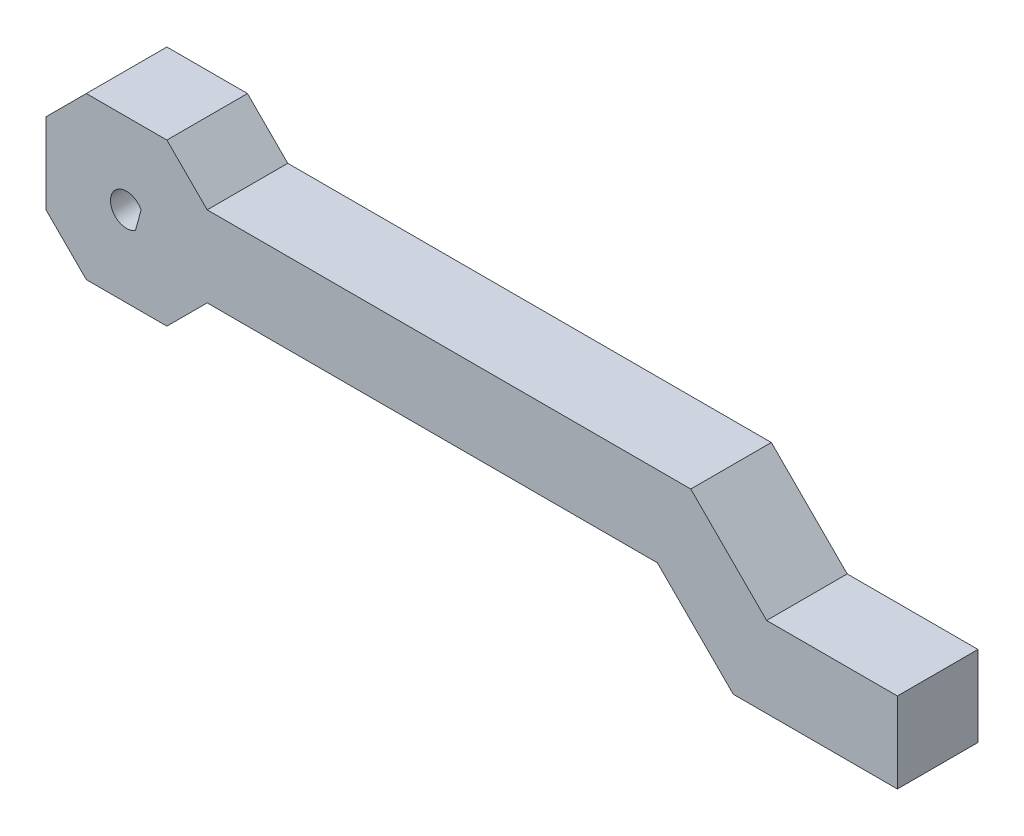
ISO-10303-21;
HEADER;
FILE_DESCRIPTION(('STEP AP214'),'2;1');
FILE_NAME('part.step','',(''),(''),'','','');
FILE_SCHEMA(('AUTOMOTIVE_DESIGN { 1 0 10303 214 1 1 1 1 }'));
ENDSEC;
DATA;
#1=APPLICATION_CONTEXT('core data for automotive mechanical design processes');
#2=APPLICATION_PROTOCOL_DEFINITION('international standard','automotive_design',2000,#1);
#3=PRODUCT_CONTEXT('',#1,'mechanical');
#4=PRODUCT('Part','Part','',(#3));
#5=PRODUCT_RELATED_PRODUCT_CATEGORY('part','',(#4));
#6=PRODUCT_DEFINITION_FORMATION('','',#4);
#7=PRODUCT_DEFINITION_CONTEXT('part definition',#1,'design');
#8=PRODUCT_DEFINITION('design','',#6,#7);
#9=PRODUCT_DEFINITION_SHAPE('','',#8);
#10=(LENGTH_UNIT() NAMED_UNIT(*) SI_UNIT(.MILLI.,.METRE.));
#11=(NAMED_UNIT(*) PLANE_ANGLE_UNIT() SI_UNIT($,.RADIAN.));
#12=(NAMED_UNIT(*) SI_UNIT($,.STERADIAN.) SOLID_ANGLE_UNIT());
#13=UNCERTAINTY_MEASURE_WITH_UNIT(LENGTH_MEASURE(1.E-05),#10,'distance_accuracy_value','');
#14=(GEOMETRIC_REPRESENTATION_CONTEXT(3) GLOBAL_UNCERTAINTY_ASSIGNED_CONTEXT((#13)) GLOBAL_UNIT_ASSIGNED_CONTEXT((#10,
#11,#12)) REPRESENTATION_CONTEXT('',''));
#15=CARTESIAN_POINT('',(0.,0.,0.));
#16=DIRECTION('',(0.,0.,1.));
#17=DIRECTION('',(1.,0.,0.));
#18=AXIS2_PLACEMENT_3D('',#15,#16,#17);
#19=CARTESIAN_POINT('',(0.,0.,20.));
#20=DIRECTION('',(0.,0.,1.));
#21=DIRECTION('',(1.,0.,0.));
#22=AXIS2_PLACEMENT_3D('',#19,#20,#21);
#23=PLANE('',#22);
#24=DIRECTION('',(0.,1.,0.));
#25=VECTOR('',#24,1.);
#26=CARTESIAN_POINT('',(85.3598963760236,1.17277647972449,20.));
#27=LINE('',#26,#25);
#28=CARTESIAN_POINT('',(85.3598963760236,1.17277647972449,20.));
#29=VERTEX_POINT('',#28);
#30=CARTESIAN_POINT('',(85.3598963760236,21.1727764797245,20.));
#31=VERTEX_POINT('',#30);
#32=EDGE_CURVE('E175',#29,#31,#27,.T.);
#33=ORIENTED_EDGE('',*,*,#32,.T.);
#34=DIRECTION('',(-1.,0.,0.));
#35=VECTOR('',#34,1.);
#36=CARTESIAN_POINT('',(85.3598963760236,21.1727764797245,20.));
#37=LINE('',#36,#35);
#38=CARTESIAN_POINT('',(52.9046994578378,21.1727764797241,20.));
#39=VERTEX_POINT('',#38);
#40=EDGE_CURVE('E179',#31,#39,#37,.T.);
#41=ORIENTED_EDGE('',*,*,#40,.T.);
#42=DIRECTION('',(-0.707106781186549,0.707106781186546,0.));
#43=VECTOR('',#42,1.);
#44=CARTESIAN_POINT('',(52.9046994578378,21.1727764797241,20.));
#45=LINE('',#44,#43);
#46=CARTESIAN_POINT('',(34.0744722902996,40.0030036472623,20.));
#47=VERTEX_POINT('',#46);
#48=EDGE_CURVE('E183',#39,#47,#45,.T.);
#49=ORIENTED_EDGE('',*,*,#48,.T.);
#50=DIRECTION('',(-1.,0.,0.));
#51=VECTOR('',#50,1.);
#52=CARTESIAN_POINT('',(-85.9255277097004,40.0030036472623,20.));
#53=LINE('',#52,#51);
#54=CARTESIAN_POINT('',(-85.9255277097004,40.0030036472623,20.));
#55=VERTEX_POINT('',#54);
#56=EDGE_CURVE('E186',#47,#55,#53,.T.);
#57=ORIENTED_EDGE('',*,*,#56,.T.);
#58=DIRECTION('',(-0.707106735333313,0.707106827039779,0.));
#59=VECTOR('',#58,1.);
#60=CARTESIAN_POINT('',(-95.9255277097004,50.0030049441876,20.));
#61=LINE('',#60,#59);
#62=CARTESIAN_POINT('',(-95.9255277097004,50.0030049441876,20.));
#63=VERTEX_POINT('',#62);
#64=EDGE_CURVE('E189',#55,#63,#61,.T.);
#65=ORIENTED_EDGE('',*,*,#64,.T.);
#66=DIRECTION('',(-1.,0.,0.));
#67=VECTOR('',#66,1.);
#68=CARTESIAN_POINT('',(-115.9255277097,50.0030049441876,20.));
#69=LINE('',#68,#67);
#70=CARTESIAN_POINT('',(-115.9255277097,50.0030049441876,20.));
#71=VERTEX_POINT('',#70);
#72=EDGE_CURVE('E192',#63,#71,#69,.T.);
#73=ORIENTED_EDGE('',*,*,#72,.T.);
#74=DIRECTION('',(-0.707106781186549,-0.707106781186546,0.));
#75=VECTOR('',#74,1.);
#76=CARTESIAN_POINT('',(-125.9255277097,40.0030049441876,20.));
#77=LINE('',#76,#75);
#78=CARTESIAN_POINT('',(-125.9255277097,40.0030049441876,20.));
#79=VERTEX_POINT('',#78);
#80=EDGE_CURVE('E195',#71,#79,#77,.T.);
#81=ORIENTED_EDGE('',*,*,#80,.T.);
#82=DIRECTION('',(0.,-1.,0.));
#83=VECTOR('',#82,1.);
#84=CARTESIAN_POINT('',(-125.9255277097,40.0030049441876,20.));
#85=LINE('',#84,#83);
#86=CARTESIAN_POINT('',(-125.9255277097,20.0030049441876,20.));
#87=VERTEX_POINT('',#86);
#88=EDGE_CURVE('E198',#79,#87,#85,.T.);
#89=ORIENTED_EDGE('',*,*,#88,.T.);
#90=DIRECTION('',(0.707106781186549,-0.707106781186546,0.));
#91=VECTOR('',#90,1.);
#92=CARTESIAN_POINT('',(-125.9255277097,20.0030049441876,20.));
#93=LINE('',#92,#91);
#94=CARTESIAN_POINT('',(-115.9255277097,10.0030049441876,20.));
#95=VERTEX_POINT('',#94);
#96=EDGE_CURVE('E201',#87,#95,#93,.T.);
#97=ORIENTED_EDGE('',*,*,#96,.T.);
#98=DIRECTION('',(1.,0.,0.));
#99=VECTOR('',#98,1.);
#100=CARTESIAN_POINT('',(-115.9255277097,10.0030049441876,20.));
#101=LINE('',#100,#99);
#102=CARTESIAN_POINT('',(-95.9255277097004,10.0030049441876,20.));
#103=VERTEX_POINT('',#102);
#104=EDGE_CURVE('E204',#95,#103,#101,.T.);
#105=ORIENTED_EDGE('',*,*,#104,.T.);
#106=DIRECTION('',(0.707106827039785,0.707106735333307,0.));
#107=VECTOR('',#106,1.);
#108=CARTESIAN_POINT('',(-95.9255277097004,10.0030049441876,20.));
#109=LINE('',#108,#107);
#110=CARTESIAN_POINT('',(-85.9255277097004,20.0030036472623,20.));
#111=VERTEX_POINT('',#110);
#112=EDGE_CURVE('E207',#103,#111,#109,.T.);
#113=ORIENTED_EDGE('',*,*,#112,.T.);
#114=DIRECTION('',(1.,0.,0.));
#115=VECTOR('',#114,1.);
#116=CARTESIAN_POINT('',(-85.9255277097004,20.0030036472623,20.));
#117=LINE('',#116,#115);
#118=CARTESIAN_POINT('',(25.7902010428377,20.0030036472623,20.));
#119=VERTEX_POINT('',#118);
#120=EDGE_CURVE('E210',#111,#119,#117,.T.);
#121=ORIENTED_EDGE('',*,*,#120,.T.);
#122=DIRECTION('',(0.707106781186549,-0.707106781186546,0.));
#123=VECTOR('',#122,1.);
#124=CARTESIAN_POINT('',(25.7902010428377,20.0030036472623,20.));
#125=LINE('',#124,#123);
#126=CARTESIAN_POINT('',(44.6204282103759,1.17277647972414,20.));
#127=VERTEX_POINT('',#126);
#128=EDGE_CURVE('E213',#119,#127,#125,.T.);
#129=ORIENTED_EDGE('',*,*,#128,.T.);
#130=DIRECTION('',(1.,0.,0.));
#131=VECTOR('',#130,1.);
#132=CARTESIAN_POINT('',(44.6204282103759,1.17277647972414,20.));
#133=LINE('',#132,#131);
#134=EDGE_CURVE('E216',#127,#29,#133,.T.);
#135=ORIENTED_EDGE('',*,*,#134,.T.);
#136=EDGE_LOOP('',(#33,#41,#49,#57,#65,#73,#81,#89,#97,#105,#113,#121,#129,#135));
#137=FACE_BOUND('',#136,.T.);
#138=DIRECTION('',(0.260619308833868,0.965441648088043,0.));
#139=VECTOR('',#138,1.);
#140=CARTESIAN_POINT('',(-103.718736643472,26.6668285115007,20.));
#141=LINE('',#140,#139);
#142=CARTESIAN_POINT('',(-103.718736643472,26.6668285115007,20.));
#143=VERTEX_POINT('',#142);
#144=CARTESIAN_POINT('',(-102.3396688874,31.7754655238714,20.));
#145=VERTEX_POINT('',#144);
#146=EDGE_CURVE('E152',#143,#145,#141,.T.);
#147=ORIENTED_EDGE('',*,*,#146,.F.);
#148=CARTESIAN_POINT('',(-105.9255277097,30.0030049441876,20.));
#149=DIRECTION('',(0.,0.,1.));
#150=DIRECTION('',(1.,0.,0.));
#151=AXIS2_PLACEMENT_3D('',#148,#149,#150);
#152=CIRCLE('',#151,4.00000000000001);
#153=EDGE_CURVE('E159',#145,#143,#152,.T.);
#154=ORIENTED_EDGE('',*,*,#153,.F.);
#155=EDGE_LOOP('',(#147,#154));
#156=FACE_BOUND('',#155,.T.);
#157=ADVANCED_FACE('F39',(#137,#156),#23,.T.);
#158=CARTESIAN_POINT('',(0.,0.,0.));
#159=DIRECTION('',(0.,0.,1.));
#160=DIRECTION('',(1.,0.,0.));
#161=AXIS2_PLACEMENT_3D('',#158,#159,#160);
#162=PLANE('',#161);
#163=DIRECTION('',(0.,1.,0.));
#164=VECTOR('',#163,1.);
#165=CARTESIAN_POINT('',(85.3598963760236,1.17277647972449,0.));
#166=LINE('',#165,#164);
#167=CARTESIAN_POINT('',(85.3598963760236,1.17277647972449,0.));
#168=VERTEX_POINT('',#167);
#169=CARTESIAN_POINT('',(85.3598963760236,21.1727764797245,0.));
#170=VERTEX_POINT('',#169);
#171=EDGE_CURVE('E174',#168,#170,#166,.T.);
#172=ORIENTED_EDGE('',*,*,#171,.F.);
#173=DIRECTION('',(1.,0.,0.));
#174=VECTOR('',#173,1.);
#175=CARTESIAN_POINT('',(44.6204282103759,1.17277647972414,0.));
#176=LINE('',#175,#174);
#177=CARTESIAN_POINT('',(44.6204282103759,1.17277647972414,0.));
#178=VERTEX_POINT('',#177);
#179=EDGE_CURVE('E180',#178,#168,#176,.T.);
#180=ORIENTED_EDGE('',*,*,#179,.F.);
#181=DIRECTION('',(0.707106781186549,-0.707106781186546,0.));
#182=VECTOR('',#181,1.);
#183=CARTESIAN_POINT('',(25.7902010428377,20.0030036472623,0.));
#184=LINE('',#183,#182);
#185=CARTESIAN_POINT('',(25.7902010428377,20.0030036472623,0.));
#186=VERTEX_POINT('',#185);
#187=EDGE_CURVE('E256',#186,#178,#184,.T.);
#188=ORIENTED_EDGE('',*,*,#187,.F.);
#189=DIRECTION('',(1.,0.,0.));
#190=VECTOR('',#189,1.);
#191=CARTESIAN_POINT('',(-85.9255277097004,20.0030036472623,0.));
#192=LINE('',#191,#190);
#193=CARTESIAN_POINT('',(-85.9255277097004,20.0030036472623,0.));
#194=VERTEX_POINT('',#193);
#195=EDGE_CURVE('E253',#194,#186,#192,.T.);
#196=ORIENTED_EDGE('',*,*,#195,.F.);
#197=DIRECTION('',(0.707106827039785,0.707106735333307,0.));
#198=VECTOR('',#197,1.);
#199=CARTESIAN_POINT('',(-95.9255277097004,10.0030049441876,0.));
#200=LINE('',#199,#198);
#201=CARTESIAN_POINT('',(-95.9255277097004,10.0030049441876,0.));
#202=VERTEX_POINT('',#201);
#203=EDGE_CURVE('E250',#202,#194,#200,.T.);
#204=ORIENTED_EDGE('',*,*,#203,.F.);
#205=DIRECTION('',(1.,0.,0.));
#206=VECTOR('',#205,1.);
#207=CARTESIAN_POINT('',(-115.9255277097,10.0030049441876,0.));
#208=LINE('',#207,#206);
#209=CARTESIAN_POINT('',(-115.9255277097,10.0030049441876,0.));
#210=VERTEX_POINT('',#209);
#211=EDGE_CURVE('E247',#210,#202,#208,.T.);
#212=ORIENTED_EDGE('',*,*,#211,.F.);
#213=DIRECTION('',(0.707106781186549,-0.707106781186546,0.));
#214=VECTOR('',#213,1.);
#215=CARTESIAN_POINT('',(-125.9255277097,20.0030049441876,0.));
#216=LINE('',#215,#214);
#217=CARTESIAN_POINT('',(-125.9255277097,20.0030049441876,0.));
#218=VERTEX_POINT('',#217);
#219=EDGE_CURVE('E244',#218,#210,#216,.T.);
#220=ORIENTED_EDGE('',*,*,#219,.F.);
#221=DIRECTION('',(0.,-1.,0.));
#222=VECTOR('',#221,1.);
#223=CARTESIAN_POINT('',(-125.9255277097,40.0030049441876,0.));
#224=LINE('',#223,#222);
#225=CARTESIAN_POINT('',(-125.9255277097,40.0030049441876,0.));
#226=VERTEX_POINT('',#225);
#227=EDGE_CURVE('E241',#226,#218,#224,.T.);
#228=ORIENTED_EDGE('',*,*,#227,.F.);
#229=DIRECTION('',(-0.707106781186549,-0.707106781186546,0.));
#230=VECTOR('',#229,1.);
#231=CARTESIAN_POINT('',(-125.9255277097,40.0030049441876,0.));
#232=LINE('',#231,#230);
#233=CARTESIAN_POINT('',(-115.9255277097,50.0030049441876,0.));
#234=VERTEX_POINT('',#233);
#235=EDGE_CURVE('E238',#234,#226,#232,.T.);
#236=ORIENTED_EDGE('',*,*,#235,.F.);
#237=DIRECTION('',(-1.,0.,0.));
#238=VECTOR('',#237,1.);
#239=CARTESIAN_POINT('',(-115.9255277097,50.0030049441876,0.));
#240=LINE('',#239,#238);
#241=CARTESIAN_POINT('',(-95.9255277097004,50.0030049441876,0.));
#242=VERTEX_POINT('',#241);
#243=EDGE_CURVE('E235',#242,#234,#240,.T.);
#244=ORIENTED_EDGE('',*,*,#243,.F.);
#245=DIRECTION('',(-0.707106735333313,0.707106827039779,0.));
#246=VECTOR('',#245,1.);
#247=CARTESIAN_POINT('',(-95.9255277097004,50.0030049441876,0.));
#248=LINE('',#247,#246);
#249=CARTESIAN_POINT('',(-85.9255277097004,40.0030036472623,0.));
#250=VERTEX_POINT('',#249);
#251=EDGE_CURVE('E232',#250,#242,#248,.T.);
#252=ORIENTED_EDGE('',*,*,#251,.F.);
#253=DIRECTION('',(-1.,0.,0.));
#254=VECTOR('',#253,1.);
#255=CARTESIAN_POINT('',(-85.9255277097004,40.0030036472623,0.));
#256=LINE('',#255,#254);
#257=CARTESIAN_POINT('',(34.0744722902996,40.0030036472623,0.));
#258=VERTEX_POINT('',#257);
#259=EDGE_CURVE('E229',#258,#250,#256,.T.);
#260=ORIENTED_EDGE('',*,*,#259,.F.);
#261=DIRECTION('',(-0.707106781186549,0.707106781186546,0.));
#262=VECTOR('',#261,1.);
#263=CARTESIAN_POINT('',(52.9046994578378,21.1727764797241,0.));
#264=LINE('',#263,#262);
#265=CARTESIAN_POINT('',(52.9046994578378,21.1727764797241,0.));
#266=VERTEX_POINT('',#265);
#267=EDGE_CURVE('E226',#266,#258,#264,.T.);
#268=ORIENTED_EDGE('',*,*,#267,.F.);
#269=DIRECTION('',(-1.,0.,0.));
#270=VECTOR('',#269,1.);
#271=CARTESIAN_POINT('',(85.3598963760236,21.1727764797245,0.));
#272=LINE('',#271,#270);
#273=EDGE_CURVE('E223',#170,#266,#272,.T.);
#274=ORIENTED_EDGE('',*,*,#273,.F.);
#275=EDGE_LOOP('',(#172,#180,#188,#196,#204,#212,#220,#228,#236,#244,#252,#260,#268,#274));
#276=FACE_BOUND('',#275,.T.);
#277=CARTESIAN_POINT('',(-105.9255277097,30.0030049441876,0.));
#278=DIRECTION('',(0.,0.,1.));
#279=DIRECTION('',(1.,0.,0.));
#280=AXIS2_PLACEMENT_3D('',#277,#278,#279);
#281=CIRCLE('',#280,4.00000000000001);
#282=CARTESIAN_POINT('',(-102.3396688874,31.7754655238714,0.));
#283=VERTEX_POINT('',#282);
#284=CARTESIAN_POINT('',(-103.718736643472,26.6668285115007,0.));
#285=VERTEX_POINT('',#284);
#286=EDGE_CURVE('E62',#283,#285,#281,.T.);
#287=ORIENTED_EDGE('',*,*,#286,.T.);
#288=DIRECTION('',(0.260619308833868,0.965441648088043,0.));
#289=VECTOR('',#288,1.);
#290=CARTESIAN_POINT('',(-103.718736643472,26.6668285115007,0.));
#291=LINE('',#290,#289);
#292=EDGE_CURVE('E165',#285,#283,#291,.T.);
#293=ORIENTED_EDGE('',*,*,#292,.T.);
#294=EDGE_LOOP('',(#287,#293));
#295=FACE_BOUND('',#294,.T.);
#296=ADVANCED_FACE('F319',(#276,#295),#162,.F.);
#297=CARTESIAN_POINT('',(85.3598963760236,1.17277647972449,20.));
#298=DIRECTION('',(-1.,0.,0.));
#299=DIRECTION('',(0.,0.,1.));
#300=AXIS2_PLACEMENT_3D('',#297,#298,#299);
#301=PLANE('',#300);
#302=ORIENTED_EDGE('',*,*,#171,.T.);
#303=DIRECTION('',(0.,0.,-1.));
#304=VECTOR('',#303,1.);
#305=CARTESIAN_POINT('',(85.3598963760236,21.1727764797245,20.));
#306=LINE('',#305,#304);
#307=EDGE_CURVE('E11',#31,#170,#306,.T.);
#308=ORIENTED_EDGE('',*,*,#307,.F.);
#309=ORIENTED_EDGE('',*,*,#32,.F.);
#310=DIRECTION('',(0.,0.,-1.));
#311=VECTOR('',#310,1.);
#312=CARTESIAN_POINT('',(85.3598963760236,1.17277647972449,20.));
#313=LINE('',#312,#311);
#314=EDGE_CURVE('E219',#29,#168,#313,.T.);
#315=ORIENTED_EDGE('',*,*,#314,.T.);
#316=EDGE_LOOP('',(#302,#308,#309,#315));
#317=FACE_BOUND('',#316,.T.);
#318=ADVANCED_FACE('F41',(#317),#301,.F.);
#319=CARTESIAN_POINT('',(85.3598963760236,21.1727764797245,20.));
#320=DIRECTION('',(0.,-1.,0.));
#321=DIRECTION('',(1.,0.,0.));
#322=AXIS2_PLACEMENT_3D('',#319,#320,#321);
#323=PLANE('',#322);
#324=ORIENTED_EDGE('',*,*,#273,.T.);
#325=DIRECTION('',(0.,0.,-1.));
#326=VECTOR('',#325,1.);
#327=CARTESIAN_POINT('',(52.9046994578378,21.1727764797241,20.));
#328=LINE('',#327,#326);
#329=EDGE_CURVE('E48',#39,#266,#328,.T.);
#330=ORIENTED_EDGE('',*,*,#329,.F.);
#331=ORIENTED_EDGE('',*,*,#40,.F.);
#332=ORIENTED_EDGE('',*,*,#307,.T.);
#333=EDGE_LOOP('',(#324,#330,#331,#332));
#334=FACE_BOUND('',#333,.T.);
#335=ADVANCED_FACE('F336',(#334),#323,.F.);
#336=CARTESIAN_POINT('',(52.9046994578378,21.1727764797241,20.));
#337=DIRECTION('',(-0.707106781186546,-0.707106781186549,0.));
#338=DIRECTION('',(0.707106781186549,-0.707106781186546,0.));
#339=AXIS2_PLACEMENT_3D('',#336,#337,#338);
#340=PLANE('',#339);
#341=ORIENTED_EDGE('',*,*,#267,.T.);
#342=DIRECTION('',(0.,0.,-1.));
#343=VECTOR('',#342,1.);
#344=CARTESIAN_POINT('',(34.0744722902996,40.0030036472623,20.));
#345=LINE('',#344,#343);
#346=EDGE_CURVE('E304',#47,#258,#345,.T.);
#347=ORIENTED_EDGE('',*,*,#346,.F.);
#348=ORIENTED_EDGE('',*,*,#48,.F.);
#349=ORIENTED_EDGE('',*,*,#329,.T.);
#350=EDGE_LOOP('',(#341,#347,#348,#349));
#351=FACE_BOUND('',#350,.T.);
#352=ADVANCED_FACE('F313',(#351),#340,.F.);
#353=CARTESIAN_POINT('',(-85.9255277097004,40.0030036472623,20.));
#354=DIRECTION('',(0.,-1.,0.));
#355=DIRECTION('',(0.,0.,-1.));
#356=AXIS2_PLACEMENT_3D('',#353,#354,#355);
#357=PLANE('',#356);
#358=ORIENTED_EDGE('',*,*,#259,.T.);
#359=DIRECTION('',(0.,0.,-1.));
#360=VECTOR('',#359,1.);
#361=CARTESIAN_POINT('',(-85.9255277097004,40.0030036472623,20.));
#362=LINE('',#361,#360);
#363=EDGE_CURVE('E300',#55,#250,#362,.T.);
#364=ORIENTED_EDGE('',*,*,#363,.F.);
#365=ORIENTED_EDGE('',*,*,#56,.F.);
#366=ORIENTED_EDGE('',*,*,#346,.T.);
#367=EDGE_LOOP('',(#358,#364,#365,#366));
#368=FACE_BOUND('',#367,.T.);
#369=ADVANCED_FACE('F325',(#368),#357,.F.);
#370=CARTESIAN_POINT('',(-95.9255277097004,50.0030049441876,20.));
#371=DIRECTION('',(-0.707106827039779,-0.707106735333313,0.));
#372=DIRECTION('',(0.707106735333313,-0.707106827039779,0.));
#373=AXIS2_PLACEMENT_3D('',#370,#371,#372);
#374=PLANE('',#373);
#375=ORIENTED_EDGE('',*,*,#251,.T.);
#376=DIRECTION('',(0.,0.,-1.));
#377=VECTOR('',#376,1.);
#378=CARTESIAN_POINT('',(-95.9255277097004,50.0030049441876,20.));
#379=LINE('',#378,#377);
#380=EDGE_CURVE('E296',#63,#242,#379,.T.);
#381=ORIENTED_EDGE('',*,*,#380,.F.);
#382=ORIENTED_EDGE('',*,*,#64,.F.);
#383=ORIENTED_EDGE('',*,*,#363,.T.);
#384=EDGE_LOOP('',(#375,#381,#382,#383));
#385=FACE_BOUND('',#384,.T.);
#386=ADVANCED_FACE('F329',(#385),#374,.F.);
#387=CARTESIAN_POINT('',(-115.9255277097,50.0030049441876,20.));
#388=DIRECTION('',(0.,-1.,0.));
#389=DIRECTION('',(0.,0.,-1.));
#390=AXIS2_PLACEMENT_3D('',#387,#388,#389);
#391=PLANE('',#390);
#392=ORIENTED_EDGE('',*,*,#243,.T.);
#393=DIRECTION('',(0.,0.,-1.));
#394=VECTOR('',#393,1.);
#395=CARTESIAN_POINT('',(-115.9255277097,50.0030049441876,20.));
#396=LINE('',#395,#394);
#397=EDGE_CURVE('E292',#71,#234,#396,.T.);
#398=ORIENTED_EDGE('',*,*,#397,.F.);
#399=ORIENTED_EDGE('',*,*,#72,.F.);
#400=ORIENTED_EDGE('',*,*,#380,.T.);
#401=EDGE_LOOP('',(#392,#398,#399,#400));
#402=FACE_BOUND('',#401,.T.);
#403=ADVANCED_FACE('F379',(#402),#391,.F.);
#404=CARTESIAN_POINT('',(-125.9255277097,40.0030049441876,20.));
#405=DIRECTION('',(0.707106781186546,-0.707106781186549,0.));
#406=DIRECTION('',(0.707106781186549,0.707106781186546,0.));
#407=AXIS2_PLACEMENT_3D('',#404,#405,#406);
#408=PLANE('',#407);
#409=ORIENTED_EDGE('',*,*,#235,.T.);
#410=DIRECTION('',(0.,0.,-1.));
#411=VECTOR('',#410,1.);
#412=CARTESIAN_POINT('',(-125.9255277097,40.0030049441876,20.));
#413=LINE('',#412,#411);
#414=EDGE_CURVE('E288',#79,#226,#413,.T.);
#415=ORIENTED_EDGE('',*,*,#414,.F.);
#416=ORIENTED_EDGE('',*,*,#80,.F.);
#417=ORIENTED_EDGE('',*,*,#397,.T.);
#418=EDGE_LOOP('',(#409,#415,#416,#417));
#419=FACE_BOUND('',#418,.T.);
#420=ADVANCED_FACE('F377',(#419),#408,.F.);
#421=CARTESIAN_POINT('',(-125.9255277097,40.0030049441876,20.));
#422=DIRECTION('',(1.,0.,0.));
#423=DIRECTION('',(0.,0.,-1.));
#424=AXIS2_PLACEMENT_3D('',#421,#422,#423);
#425=PLANE('',#424);
#426=ORIENTED_EDGE('',*,*,#227,.T.);
#427=DIRECTION('',(0.,0.,-1.));
#428=VECTOR('',#427,1.);
#429=CARTESIAN_POINT('',(-125.9255277097,20.0030049441876,20.));
#430=LINE('',#429,#428);
#431=EDGE_CURVE('E284',#87,#218,#430,.T.);
#432=ORIENTED_EDGE('',*,*,#431,.F.);
#433=ORIENTED_EDGE('',*,*,#88,.F.);
#434=ORIENTED_EDGE('',*,*,#414,.T.);
#435=EDGE_LOOP('',(#426,#432,#433,#434));
#436=FACE_BOUND('',#435,.T.);
#437=ADVANCED_FACE('F372',(#436),#425,.F.);
#438=CARTESIAN_POINT('',(-125.9255277097,20.0030049441876,20.));
#439=DIRECTION('',(0.707106781186546,0.707106781186549,0.));
#440=DIRECTION('',(-0.707106781186549,0.707106781186546,0.));
#441=AXIS2_PLACEMENT_3D('',#438,#439,#440);
#442=PLANE('',#441);
#443=ORIENTED_EDGE('',*,*,#219,.T.);
#444=DIRECTION('',(0.,0.,-1.));
#445=VECTOR('',#444,1.);
#446=CARTESIAN_POINT('',(-115.9255277097,10.0030049441876,20.));
#447=LINE('',#446,#445);
#448=EDGE_CURVE('E280',#95,#210,#447,.T.);
#449=ORIENTED_EDGE('',*,*,#448,.F.);
#450=ORIENTED_EDGE('',*,*,#96,.F.);
#451=ORIENTED_EDGE('',*,*,#431,.T.);
#452=EDGE_LOOP('',(#443,#449,#450,#451));
#453=FACE_BOUND('',#452,.T.);
#454=ADVANCED_FACE('F367',(#453),#442,.F.);
#455=CARTESIAN_POINT('',(-115.9255277097,10.0030049441876,20.));
#456=DIRECTION('',(0.,1.,0.));
#457=DIRECTION('',(0.,0.,1.));
#458=AXIS2_PLACEMENT_3D('',#455,#456,#457);
#459=PLANE('',#458);
#460=ORIENTED_EDGE('',*,*,#211,.T.);
#461=DIRECTION('',(0.,0.,-1.));
#462=VECTOR('',#461,1.);
#463=CARTESIAN_POINT('',(-95.9255277097004,10.0030049441876,20.));
#464=LINE('',#463,#462);
#465=EDGE_CURVE('E276',#103,#202,#464,.T.);
#466=ORIENTED_EDGE('',*,*,#465,.F.);
#467=ORIENTED_EDGE('',*,*,#104,.F.);
#468=ORIENTED_EDGE('',*,*,#448,.T.);
#469=EDGE_LOOP('',(#460,#466,#467,#468));
#470=FACE_BOUND('',#469,.T.);
#471=ADVANCED_FACE('F363',(#470),#459,.F.);
#472=CARTESIAN_POINT('',(-95.9255277097004,10.0030049441876,20.));
#473=DIRECTION('',(-0.707106735333307,0.707106827039785,0.));
#474=DIRECTION('',(-0.707106827039785,-0.707106735333307,0.));
#475=AXIS2_PLACEMENT_3D('',#472,#473,#474);
#476=PLANE('',#475);
#477=ORIENTED_EDGE('',*,*,#203,.T.);
#478=DIRECTION('',(0.,0.,-1.));
#479=VECTOR('',#478,1.);
#480=CARTESIAN_POINT('',(-85.9255277097004,20.0030036472623,20.));
#481=LINE('',#480,#479);
#482=EDGE_CURVE('E272',#111,#194,#481,.T.);
#483=ORIENTED_EDGE('',*,*,#482,.F.);
#484=ORIENTED_EDGE('',*,*,#112,.F.);
#485=ORIENTED_EDGE('',*,*,#465,.T.);
#486=EDGE_LOOP('',(#477,#483,#484,#485));
#487=FACE_BOUND('',#486,.T.);
#488=ADVANCED_FACE('F358',(#487),#476,.F.);
#489=CARTESIAN_POINT('',(-85.9255277097004,20.0030036472623,20.));
#490=DIRECTION('',(0.,1.,0.));
#491=DIRECTION('',(0.,0.,1.));
#492=AXIS2_PLACEMENT_3D('',#489,#490,#491);
#493=PLANE('',#492);
#494=ORIENTED_EDGE('',*,*,#195,.T.);
#495=DIRECTION('',(0.,0.,-1.));
#496=VECTOR('',#495,1.);
#497=CARTESIAN_POINT('',(25.7902010428377,20.0030036472623,20.));
#498=LINE('',#497,#496);
#499=EDGE_CURVE('E268',#119,#186,#498,.T.);
#500=ORIENTED_EDGE('',*,*,#499,.F.);
#501=ORIENTED_EDGE('',*,*,#120,.F.);
#502=ORIENTED_EDGE('',*,*,#482,.T.);
#503=EDGE_LOOP('',(#494,#500,#501,#502));
#504=FACE_BOUND('',#503,.T.);
#505=ADVANCED_FACE('F352',(#504),#493,.F.);
#506=CARTESIAN_POINT('',(25.7902010428377,20.0030036472623,20.));
#507=DIRECTION('',(0.707106781186546,0.707106781186549,0.));
#508=DIRECTION('',(-0.707106781186549,0.707106781186546,0.));
#509=AXIS2_PLACEMENT_3D('',#506,#507,#508);
#510=PLANE('',#509);
#511=ORIENTED_EDGE('',*,*,#187,.T.);
#512=DIRECTION('',(0.,0.,-1.));
#513=VECTOR('',#512,1.);
#514=CARTESIAN_POINT('',(44.6204282103759,1.17277647972414,20.));
#515=LINE('',#514,#513);
#516=EDGE_CURVE('E264',#127,#178,#515,.T.);
#517=ORIENTED_EDGE('',*,*,#516,.F.);
#518=ORIENTED_EDGE('',*,*,#128,.F.);
#519=ORIENTED_EDGE('',*,*,#499,.T.);
#520=EDGE_LOOP('',(#511,#517,#518,#519));
#521=FACE_BOUND('',#520,.T.);
#522=ADVANCED_FACE('F348',(#521),#510,.F.);
#523=CARTESIAN_POINT('',(44.6204282103759,1.17277647972414,20.));
#524=DIRECTION('',(0.,1.,0.));
#525=DIRECTION('',(-1.,0.,0.));
#526=AXIS2_PLACEMENT_3D('',#523,#524,#525);
#527=PLANE('',#526);
#528=ORIENTED_EDGE('',*,*,#179,.T.);
#529=ORIENTED_EDGE('',*,*,#314,.F.);
#530=ORIENTED_EDGE('',*,*,#134,.F.);
#531=ORIENTED_EDGE('',*,*,#516,.T.);
#532=EDGE_LOOP('',(#528,#529,#530,#531));
#533=FACE_BOUND('',#532,.T.);
#534=ADVANCED_FACE('F343',(#533),#527,.F.);
#535=CARTESIAN_POINT('',(-105.9255277097,30.0030049441876,20.));
#536=DIRECTION('',(0.,0.,-1.));
#537=DIRECTION('',(-1.,0.,0.));
#538=AXIS2_PLACEMENT_3D('',#535,#536,#537);
#539=CYLINDRICAL_SURFACE('',#538,4.00000000000001);
#540=ORIENTED_EDGE('',*,*,#286,.F.);
#541=DIRECTION('',(0.,0.,-1.));
#542=VECTOR('',#541,1.);
#543=CARTESIAN_POINT('',(-102.3396688874,31.7754655238714,20.));
#544=LINE('',#543,#542);
#545=EDGE_CURVE('E154',#145,#283,#544,.T.);
#546=ORIENTED_EDGE('',*,*,#545,.F.);
#547=ORIENTED_EDGE('',*,*,#153,.T.);
#548=DIRECTION('',(0.,0.,-1.));
#549=VECTOR('',#548,1.);
#550=CARTESIAN_POINT('',(-103.718736643472,26.6668285115007,20.));
#551=LINE('',#550,#549);
#552=EDGE_CURVE('E55',#143,#285,#551,.T.);
#553=ORIENTED_EDGE('',*,*,#552,.T.);
#554=EDGE_LOOP('',(#540,#546,#547,#553));
#555=FACE_BOUND('',#554,.T.);
#556=ADVANCED_FACE('F161',(#555),#539,.F.);
#557=CARTESIAN_POINT('',(-103.718736643472,26.6668285115007,20.));
#558=DIRECTION('',(-0.965441648088043,0.260619308833868,0.));
#559=DIRECTION('',(-0.260619308833868,-0.965441648088043,0.));
#560=AXIS2_PLACEMENT_3D('',#557,#558,#559);
#561=PLANE('',#560);
#562=ORIENTED_EDGE('',*,*,#292,.F.);
#563=ORIENTED_EDGE('',*,*,#552,.F.);
#564=ORIENTED_EDGE('',*,*,#146,.T.);
#565=ORIENTED_EDGE('',*,*,#545,.T.);
#566=EDGE_LOOP('',(#562,#563,#564,#565));
#567=FACE_BOUND('',#566,.T.);
#568=ADVANCED_FACE('F153',(#567),#561,.T.);
#569=CLOSED_SHELL('',(#157,#296,#318,#335,#352,#369,#386,#403,#420,#437,#454,#471,#488,#505,
#522,#534,#556,#568));
#570=MANIFOLD_SOLID_BREP('B2',#569);
#571=ADVANCED_BREP_SHAPE_REPRESENTATION('',(#18,#570),#14);
#572=SHAPE_DEFINITION_REPRESENTATION(#9,#571);
ENDSEC;
END-ISO-10303-21;
